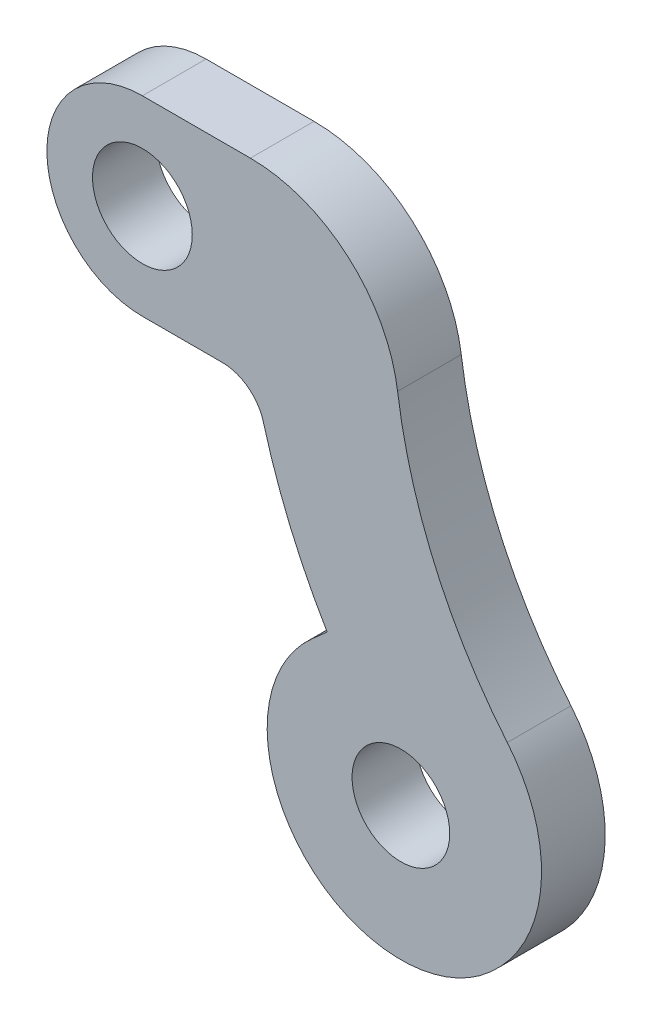
ISO-10303-21;
HEADER;
FILE_DESCRIPTION(('STEP AP214'),'2;1');
FILE_NAME('part.step','',(''),(''),'','','');
FILE_SCHEMA(('AUTOMOTIVE_DESIGN { 1 0 10303 214 1 1 1 1 }'));
ENDSEC;
DATA;
#1=APPLICATION_CONTEXT('core data for automotive mechanical design processes');
#2=APPLICATION_PROTOCOL_DEFINITION('international standard','automotive_design',2000,#1);
#3=PRODUCT_CONTEXT('',#1,'mechanical');
#4=PRODUCT('Part','Part','',(#3));
#5=PRODUCT_RELATED_PRODUCT_CATEGORY('part','',(#4));
#6=PRODUCT_DEFINITION_FORMATION('','',#4);
#7=PRODUCT_DEFINITION_CONTEXT('part definition',#1,'design');
#8=PRODUCT_DEFINITION('design','',#6,#7);
#9=PRODUCT_DEFINITION_SHAPE('','',#8);
#10=(LENGTH_UNIT() NAMED_UNIT(*) SI_UNIT(.MILLI.,.METRE.));
#11=(NAMED_UNIT(*) PLANE_ANGLE_UNIT() SI_UNIT($,.RADIAN.));
#12=(NAMED_UNIT(*) SI_UNIT($,.STERADIAN.) SOLID_ANGLE_UNIT());
#13=UNCERTAINTY_MEASURE_WITH_UNIT(LENGTH_MEASURE(1.E-05),#10,'distance_accuracy_value','');
#14=(GEOMETRIC_REPRESENTATION_CONTEXT(3) GLOBAL_UNCERTAINTY_ASSIGNED_CONTEXT((#13)) GLOBAL_UNIT_ASSIGNED_CONTEXT((#10,
#11,#12)) REPRESENTATION_CONTEXT('',''));
#15=CARTESIAN_POINT('',(0.,0.,0.));
#16=DIRECTION('',(0.,0.,1.));
#17=DIRECTION('',(1.,0.,0.));
#18=AXIS2_PLACEMENT_3D('',#15,#16,#17);
#19=CARTESIAN_POINT('',(-19.9422261752407,44.7189600164803,-127.243878979662));
#20=DIRECTION('',(0.,0.,-1.));
#21=DIRECTION('',(-1.,0.,0.));
#22=AXIS2_PLACEMENT_3D('',#19,#20,#21);
#23=CYLINDRICAL_SURFACE('',#22,2.);
#24=CARTESIAN_POINT('',(-19.9422261752407,44.7189600164803,-130.243878979662));
#25=DIRECTION('',(0.,0.,1.));
#26=DIRECTION('',(1.,0.,0.));
#27=AXIS2_PLACEMENT_3D('',#24,#25,#26);
#28=CIRCLE('',#27,2.);
#29=CARTESIAN_POINT('',(-19.9422261752407,46.7189600164803,-130.243878979662));
#30=VERTEX_POINT('',#29);
#31=CARTESIAN_POINT('',(-18.0136160189661,45.2485477541048,-130.243878979662));
#32=VERTEX_POINT('',#31);
#33=EDGE_CURVE('E162',#30,#32,#28,.F.);
#34=ORIENTED_EDGE('',*,*,#33,.T.);
#35=DIRECTION('',(0.,0.,-1.));
#36=VECTOR('',#35,1.);
#37=CARTESIAN_POINT('',(-18.0136160189661,45.2485477541048,-127.243878979662));
#38=LINE('',#37,#36);
#39=CARTESIAN_POINT('',(-18.0136160189661,45.2485477541048,-127.243878979662));
#40=VERTEX_POINT('',#39);
#41=EDGE_CURVE('E11',#40,#32,#38,.T.);
#42=ORIENTED_EDGE('',*,*,#41,.F.);
#43=CARTESIAN_POINT('',(-19.9422261752407,44.7189600164803,-127.243878979662));
#44=DIRECTION('',(0.,0.,1.));
#45=DIRECTION('',(1.,0.,0.));
#46=AXIS2_PLACEMENT_3D('',#43,#44,#45);
#47=CIRCLE('',#46,2.);
#48=CARTESIAN_POINT('',(-19.9422261752407,46.7189600164803,-127.243878979662));
#49=VERTEX_POINT('',#48);
#50=EDGE_CURVE('E192',#49,#40,#47,.F.);
#51=ORIENTED_EDGE('',*,*,#50,.F.);
#52=DIRECTION('',(0.,0.,-1.));
#53=VECTOR('',#52,1.);
#54=CARTESIAN_POINT('',(-19.9422261752407,46.7189600164803,-127.243878979662));
#55=LINE('',#54,#53);
#56=EDGE_CURVE('E161',#49,#30,#55,.T.);
#57=ORIENTED_EDGE('',*,*,#56,.T.);
#58=EDGE_LOOP('',(#34,#42,#51,#57));
#59=FACE_BOUND('',#58,.T.);
#60=ADVANCED_FACE('F39',(#59),#23,.F.);
#61=CARTESIAN_POINT('',(9.61372850102481,52.8348932025687,-127.243878979662));
#62=DIRECTION('',(0.,0.,-1.));
#63=DIRECTION('',(-1.,0.,0.));
#64=AXIS2_PLACEMENT_3D('',#61,#62,#63);
#65=CYLINDRICAL_SURFACE('',#64,28.6500052117645);
#66=CARTESIAN_POINT('',(9.61372850102481,52.8348932025687,-130.243878979662));
#67=DIRECTION('',(0.,0.,1.));
#68=DIRECTION('',(1.,0.,0.));
#69=AXIS2_PLACEMENT_3D('',#66,#67,#68);
#70=CIRCLE('',#69,28.6500052117645);
#71=CARTESIAN_POINT('',(-15.0100594881716,38.189351894841,-130.243878979662));
#72=VERTEX_POINT('',#71);
#73=EDGE_CURVE('E165',#32,#72,#70,.T.);
#74=ORIENTED_EDGE('',*,*,#73,.T.);
#75=DIRECTION('',(0.,0.,-1.));
#76=VECTOR('',#75,1.);
#77=CARTESIAN_POINT('',(-15.0100594881716,38.189351894841,-127.243878979662));
#78=LINE('',#77,#76);
#79=CARTESIAN_POINT('',(-15.0100594881716,38.189351894841,-127.243878979662));
#80=VERTEX_POINT('',#79);
#81=EDGE_CURVE('E47',#80,#72,#78,.T.);
#82=ORIENTED_EDGE('',*,*,#81,.F.);
#83=CARTESIAN_POINT('',(9.61372850102481,52.8348932025687,-127.243878979662));
#84=DIRECTION('',(0.,0.,1.));
#85=DIRECTION('',(1.,0.,0.));
#86=AXIS2_PLACEMENT_3D('',#83,#84,#85);
#87=CIRCLE('',#86,28.6500052117645);
#88=EDGE_CURVE('E106',#40,#80,#87,.T.);
#89=ORIENTED_EDGE('',*,*,#88,.F.);
#90=ORIENTED_EDGE('',*,*,#41,.T.);
#91=EDGE_LOOP('',(#74,#82,#89,#90));
#92=FACE_BOUND('',#91,.T.);
#93=ADVANCED_FACE('F256',(#92),#65,.T.);
#94=CARTESIAN_POINT('',(-25.5317117816848,28.8911475424345,-127.243878979662));
#95=DIRECTION('',(0.662197796471688,-0.749329085481166,0.));
#96=DIRECTION('',(0.749329085481166,0.662197796471688,0.));
#97=AXIS2_PLACEMENT_3D('',#94,#95,#96);
#98=PLANE('',#97);
#99=DIRECTION('',(-0.749329085481166,-0.662197796471688,0.));
#100=VECTOR('',#99,1.);
#101=CARTESIAN_POINT('',(-25.5317117816848,28.8911475424345,-130.243878979662));
#102=LINE('',#101,#100);
#103=CARTESIAN_POINT('',(-15.7081176167469,37.5724633161,-130.243878979662));
#104=VERTEX_POINT('',#103);
#105=EDGE_CURVE('E167',#72,#104,#102,.T.);
#106=ORIENTED_EDGE('',*,*,#105,.T.);
#107=DIRECTION('',(0.,0.,-1.));
#108=VECTOR('',#107,1.);
#109=CARTESIAN_POINT('',(-15.7081176167469,37.5724633161,-127.243878979662));
#110=LINE('',#109,#108);
#111=CARTESIAN_POINT('',(-15.7081176167469,37.5724633161,-127.243878979662));
#112=VERTEX_POINT('',#111);
#113=EDGE_CURVE('E205',#112,#104,#110,.T.);
#114=ORIENTED_EDGE('',*,*,#113,.F.);
#115=DIRECTION('',(-0.749329085481166,-0.662197796471688,0.));
#116=VECTOR('',#115,1.);
#117=CARTESIAN_POINT('',(-25.5317117816848,28.8911475424345,-127.243878979662));
#118=LINE('',#117,#116);
#119=EDGE_CURVE('E213',#80,#112,#118,.T.);
#120=ORIENTED_EDGE('',*,*,#119,.F.);
#121=ORIENTED_EDGE('',*,*,#81,.T.);
#122=EDGE_LOOP('',(#106,#114,#120,#121));
#123=FACE_BOUND('',#122,.T.);
#124=ADVANCED_FACE('F211',(#123),#98,.F.);
#125=CARTESIAN_POINT('',(-11.5362714989752,32.8516900775687,-127.243878979662));
#126=DIRECTION('',(0.,0.,-1.));
#127=DIRECTION('',(-1.,0.,0.));
#128=AXIS2_PLACEMENT_3D('',#125,#126,#127);
#129=CYLINDRICAL_SURFACE('',#128,6.30000000000002);
#130=CARTESIAN_POINT('',(-11.5362714989752,32.8516900775687,-130.243878979662));
#131=DIRECTION('',(0.,0.,1.));
#132=DIRECTION('',(1.,0.,0.));
#133=AXIS2_PLACEMENT_3D('',#130,#131,#132);
#134=CIRCLE('',#133,6.30000000000002);
#135=CARTESIAN_POINT('',(-7.36442538120341,28.1309168390375,-130.243878979662));
#136=VERTEX_POINT('',#135);
#137=EDGE_CURVE('E169',#104,#136,#134,.T.);
#138=ORIENTED_EDGE('',*,*,#137,.T.);
#139=DIRECTION('',(0.,0.,-1.));
#140=VECTOR('',#139,1.);
#141=CARTESIAN_POINT('',(-7.36442538120341,28.1309168390375,-127.243878979662));
#142=LINE('',#141,#140);
#143=CARTESIAN_POINT('',(-7.36442538120341,28.1309168390375,-127.243878979662));
#144=VERTEX_POINT('',#143);
#145=EDGE_CURVE('E202',#144,#136,#142,.T.);
#146=ORIENTED_EDGE('',*,*,#145,.F.);
#147=CARTESIAN_POINT('',(-11.5362714989752,32.8516900775687,-127.243878979662));
#148=DIRECTION('',(0.,0.,1.));
#149=DIRECTION('',(1.,0.,0.));
#150=AXIS2_PLACEMENT_3D('',#147,#148,#149);
#151=CIRCLE('',#150,6.30000000000002);
#152=EDGE_CURVE('E232',#112,#144,#151,.T.);
#153=ORIENTED_EDGE('',*,*,#152,.F.);
#154=ORIENTED_EDGE('',*,*,#113,.T.);
#155=EDGE_LOOP('',(#138,#146,#153,#154));
#156=FACE_BOUND('',#155,.T.);
#157=ADVANCED_FACE('F222',(#156),#129,.T.);
#158=CARTESIAN_POINT('',(-17.1880195461419,19.4496010653708,-127.243878979662));
#159=DIRECTION('',(-0.662197796471717,0.749329085481141,0.));
#160=DIRECTION('',(-0.749329085481141,-0.662197796471717,0.));
#161=AXIS2_PLACEMENT_3D('',#158,#159,#160);
#162=PLANE('',#161);
#163=DIRECTION('',(0.749329085481141,0.662197796471717,0.));
#164=VECTOR('',#163,1.);
#165=CARTESIAN_POINT('',(-17.1880195461419,19.4496010653708,-130.243878979662));
#166=LINE('',#165,#164);
#167=CARTESIAN_POINT('',(-7.27434556011419,28.2105222623257,-130.243878979662));
#168=VERTEX_POINT('',#167);
#169=EDGE_CURVE('E171',#136,#168,#166,.T.);
#170=ORIENTED_EDGE('',*,*,#169,.T.);
#171=DIRECTION('',(0.,0.,-1.));
#172=VECTOR('',#171,1.);
#173=CARTESIAN_POINT('',(-7.27434556011419,28.2105222623257,-127.243878979662));
#174=LINE('',#173,#172);
#175=CARTESIAN_POINT('',(-7.27434556011419,28.2105222623257,-127.243878979662));
#176=VERTEX_POINT('',#175);
#177=EDGE_CURVE('E200',#176,#168,#174,.T.);
#178=ORIENTED_EDGE('',*,*,#177,.F.);
#179=DIRECTION('',(0.749329085481141,0.662197796471717,0.));
#180=VECTOR('',#179,1.);
#181=CARTESIAN_POINT('',(-17.1880195461419,19.4496010653708,-127.243878979662));
#182=LINE('',#181,#180);
#183=EDGE_CURVE('E228',#144,#176,#182,.T.);
#184=ORIENTED_EDGE('',*,*,#183,.F.);
#185=ORIENTED_EDGE('',*,*,#145,.T.);
#186=EDGE_LOOP('',(#170,#178,#184,#185));
#187=FACE_BOUND('',#186,.T.);
#188=ADVANCED_FACE('F226',(#187),#162,.F.);
#189=CARTESIAN_POINT('',(-11.9097301354153,33.4558258606926,-127.243878979662));
#190=DIRECTION('',(0.,0.,-1.));
#191=DIRECTION('',(-1.,0.,0.));
#192=AXIS2_PLACEMENT_3D('',#189,#190,#191);
#193=CYLINDRICAL_SURFACE('',#192,7.);
#194=CARTESIAN_POINT('',(-11.9097301354153,33.4558258606926,-130.243878979662));
#195=DIRECTION('',(0.,0.,1.));
#196=DIRECTION('',(1.,0.,0.));
#197=AXIS2_PLACEMENT_3D('',#194,#195,#196);
#198=CIRCLE('',#197,7.);
#199=CARTESIAN_POINT('',(-6.52289642895534,37.925951431518,-130.243878979662));
#200=VERTEX_POINT('',#199);
#201=EDGE_CURVE('E174',#200,#168,#198,.F.);
#202=ORIENTED_EDGE('',*,*,#201,.F.);
#203=DIRECTION('',(0.,0.,-1.));
#204=VECTOR('',#203,1.);
#205=CARTESIAN_POINT('',(-6.52289642895534,37.925951431518,-127.243878979662));
#206=LINE('',#205,#204);
#207=CARTESIAN_POINT('',(-6.52289642895534,37.925951431518,-127.243878979662));
#208=VERTEX_POINT('',#207);
#209=EDGE_CURVE('E198',#208,#200,#206,.T.);
#210=ORIENTED_EDGE('',*,*,#209,.F.);
#211=CARTESIAN_POINT('',(-11.9097301354153,33.4558258606926,-127.243878979662));
#212=DIRECTION('',(0.,0.,1.));
#213=DIRECTION('',(1.,0.,0.));
#214=AXIS2_PLACEMENT_3D('',#211,#212,#213);
#215=CIRCLE('',#214,7.);
#216=EDGE_CURVE('E231',#208,#176,#215,.F.);
#217=ORIENTED_EDGE('',*,*,#216,.T.);
#218=ORIENTED_EDGE('',*,*,#177,.T.);
#219=EDGE_LOOP('',(#202,#210,#217,#218));
#220=FACE_BOUND('',#219,.T.);
#221=ADVANCED_FACE('F243',(#220),#193,.T.);
#222=CARTESIAN_POINT('',(11.4637285010269,52.8516900775688,-127.243878979662));
#223=DIRECTION('',(0.,0.,-1.));
#224=DIRECTION('',(-1.,0.,0.));
#225=AXIS2_PLACEMENT_3D('',#222,#223,#224);
#226=CYLINDRICAL_SURFACE('',#225,23.3729833462071);
#227=CARTESIAN_POINT('',(11.4637285010269,52.8516900775688,-130.243878979662));
#228=DIRECTION('',(0.,0.,1.));
#229=DIRECTION('',(1.,0.,0.));
#230=AXIS2_PLACEMENT_3D('',#227,#228,#229);
#231=CIRCLE('',#230,23.3729833462071);
#232=CARTESIAN_POINT('',(-11.6918808655017,49.6714219494379,-130.243878979662));
#233=VERTEX_POINT('',#232);
#234=EDGE_CURVE('E177',#233,#200,#231,.T.);
#235=ORIENTED_EDGE('',*,*,#234,.F.);
#236=DIRECTION('',(0.,0.,-1.));
#237=VECTOR('',#236,1.);
#238=CARTESIAN_POINT('',(-11.6918808655017,49.6714219494379,-127.243878979662));
#239=LINE('',#238,#237);
#240=CARTESIAN_POINT('',(-11.6918808655017,49.6714219494379,-127.243878979662));
#241=VERTEX_POINT('',#240);
#242=EDGE_CURVE('E196',#241,#233,#239,.T.);
#243=ORIENTED_EDGE('',*,*,#242,.F.);
#244=CARTESIAN_POINT('',(11.4637285010269,52.8516900775688,-127.243878979662));
#245=DIRECTION('',(0.,0.,1.));
#246=DIRECTION('',(1.,0.,0.));
#247=AXIS2_PLACEMENT_3D('',#244,#245,#246);
#248=CIRCLE('',#247,23.3729833462071);
#249=EDGE_CURVE('E150',#241,#208,#248,.T.);
#250=ORIENTED_EDGE('',*,*,#249,.T.);
#251=ORIENTED_EDGE('',*,*,#209,.T.);
#252=EDGE_LOOP('',(#235,#243,#250,#251));
#253=FACE_BOUND('',#252,.T.);
#254=ADVANCED_FACE('F240',(#253),#226,.F.);
#255=CARTESIAN_POINT('',(-18.6267792977981,48.7189600164802,-127.243878979662));
#256=DIRECTION('',(0.,0.,-1.));
#257=DIRECTION('',(-1.,0.,0.));
#258=AXIS2_PLACEMENT_3D('',#255,#256,#257);
#259=CYLINDRICAL_SURFACE('',#258,7.);
#260=CARTESIAN_POINT('',(-18.6267792977981,48.7189600164802,-130.243878979662));
#261=DIRECTION('',(0.,0.,1.));
#262=DIRECTION('',(1.,0.,0.));
#263=AXIS2_PLACEMENT_3D('',#260,#261,#262);
#264=CIRCLE('',#263,7.);
#265=CARTESIAN_POINT('',(-18.6267792977981,55.7189600164802,-130.243878979662));
#266=VERTEX_POINT('',#265);
#267=EDGE_CURVE('E180',#233,#266,#264,.T.);
#268=ORIENTED_EDGE('',*,*,#267,.T.);
#269=DIRECTION('',(0.,0.,-1.));
#270=VECTOR('',#269,1.);
#271=CARTESIAN_POINT('',(-18.6267792977981,55.7189600164802,-127.243878979662));
#272=LINE('',#271,#270);
#273=CARTESIAN_POINT('',(-18.6267792977981,55.7189600164802,-127.243878979662));
#274=VERTEX_POINT('',#273);
#275=EDGE_CURVE('E137',#274,#266,#272,.T.);
#276=ORIENTED_EDGE('',*,*,#275,.F.);
#277=CARTESIAN_POINT('',(-18.6267792977981,48.7189600164802,-127.243878979662));
#278=DIRECTION('',(0.,0.,1.));
#279=DIRECTION('',(1.,0.,0.));
#280=AXIS2_PLACEMENT_3D('',#277,#278,#279);
#281=CIRCLE('',#280,7.);
#282=EDGE_CURVE('E147',#241,#274,#281,.T.);
#283=ORIENTED_EDGE('',*,*,#282,.F.);
#284=ORIENTED_EDGE('',*,*,#242,.T.);
#285=EDGE_LOOP('',(#268,#276,#283,#284));
#286=FACE_BOUND('',#285,.T.);
#287=ADVANCED_FACE('F246',(#286),#259,.T.);
#288=CARTESIAN_POINT('',(0.,55.7189600164802,-127.243878979662));
#289=DIRECTION('',(0.,1.,0.));
#290=DIRECTION('',(0.,0.,1.));
#291=AXIS2_PLACEMENT_3D('',#288,#289,#290);
#292=PLANE('',#291);
#293=DIRECTION('',(1.,0.,0.));
#294=VECTOR('',#293,1.);
#295=CARTESIAN_POINT('',(0.,55.7189600164802,-130.243878979662));
#296=LINE('',#295,#294);
#297=CARTESIAN_POINT('',(-23.7160538447542,55.7189600164802,-130.243878979662));
#298=VERTEX_POINT('',#297);
#299=EDGE_CURVE('E136',#298,#266,#296,.T.);
#300=ORIENTED_EDGE('',*,*,#299,.F.);
#301=DIRECTION('',(0.,0.,-1.));
#302=VECTOR('',#301,1.);
#303=CARTESIAN_POINT('',(-23.7160538447542,55.7189600164802,-127.243878979662));
#304=LINE('',#303,#302);
#305=CARTESIAN_POINT('',(-23.7160538447542,55.7189600164802,-127.243878979662));
#306=VERTEX_POINT('',#305);
#307=EDGE_CURVE('E130',#306,#298,#304,.T.);
#308=ORIENTED_EDGE('',*,*,#307,.F.);
#309=DIRECTION('',(1.,0.,0.));
#310=VECTOR('',#309,1.);
#311=CARTESIAN_POINT('',(0.,55.7189600164802,-127.243878979662));
#312=LINE('',#311,#310);
#313=EDGE_CURVE('E134',#306,#274,#312,.T.);
#314=ORIENTED_EDGE('',*,*,#313,.T.);
#315=ORIENTED_EDGE('',*,*,#275,.T.);
#316=EDGE_LOOP('',(#300,#308,#314,#315));
#317=FACE_BOUND('',#316,.T.);
#318=ADVANCED_FACE('F132',(#317),#292,.T.);
#319=CARTESIAN_POINT('',(-23.7160538447542,51.2189600164802,-127.243878979662));
#320=DIRECTION('',(0.,0.,-1.));
#321=DIRECTION('',(-1.,0.,0.));
#322=AXIS2_PLACEMENT_3D('',#319,#320,#321);
#323=CYLINDRICAL_SURFACE('',#322,4.5);
#324=CARTESIAN_POINT('',(-23.7160538447542,51.2189600164802,-130.243878979662));
#325=DIRECTION('',(0.,0.,1.));
#326=DIRECTION('',(1.,0.,0.));
#327=AXIS2_PLACEMENT_3D('',#324,#325,#326);
#328=CIRCLE('',#327,4.5);
#329=CARTESIAN_POINT('',(-23.7160538447542,46.7189600164802,-130.243878979662));
#330=VERTEX_POINT('',#329);
#331=EDGE_CURVE('E92',#298,#330,#328,.T.);
#332=ORIENTED_EDGE('',*,*,#331,.T.);
#333=DIRECTION('',(0.,0.,-1.));
#334=VECTOR('',#333,1.);
#335=CARTESIAN_POINT('',(-23.7160538447542,46.7189600164802,-127.243878979662));
#336=LINE('',#335,#334);
#337=CARTESIAN_POINT('',(-23.7160538447542,46.7189600164802,-127.243878979662));
#338=VERTEX_POINT('',#337);
#339=EDGE_CURVE('E138',#338,#330,#336,.T.);
#340=ORIENTED_EDGE('',*,*,#339,.F.);
#341=CARTESIAN_POINT('',(-23.7160538447542,51.2189600164802,-127.243878979662));
#342=DIRECTION('',(0.,0.,1.));
#343=DIRECTION('',(1.,0.,0.));
#344=AXIS2_PLACEMENT_3D('',#341,#342,#343);
#345=CIRCLE('',#344,4.5);
#346=EDGE_CURVE('E140',#306,#338,#345,.T.);
#347=ORIENTED_EDGE('',*,*,#346,.F.);
#348=ORIENTED_EDGE('',*,*,#307,.T.);
#349=EDGE_LOOP('',(#332,#340,#347,#348));
#350=FACE_BOUND('',#349,.T.);
#351=ADVANCED_FACE('F141',(#350),#323,.T.);
#352=CARTESIAN_POINT('',(-23.7160538447542,51.2189600164802,-127.243878979662));
#353=DIRECTION('',(0.,0.,-1.));
#354=DIRECTION('',(-1.,0.,0.));
#355=AXIS2_PLACEMENT_3D('',#352,#353,#354);
#356=CYLINDRICAL_SURFACE('',#355,2.35);
#357=CARTESIAN_POINT('',(-23.7160538447542,51.2189600164802,-127.243878979662));
#358=DIRECTION('',(0.,0.,1.));
#359=DIRECTION('',(1.,0.,0.));
#360=AXIS2_PLACEMENT_3D('',#357,#358,#359);
#361=CIRCLE('',#360,2.35);
#362=CARTESIAN_POINT('',(-21.3660538447542,51.2189600164802,-127.243878979662));
#363=VERTEX_POINT('',#362);
#364=EDGE_CURVE('E155',#363,#363,#361,.T.);
#365=ORIENTED_EDGE('',*,*,#364,.T.);
#366=EDGE_LOOP('',(#365));
#367=FACE_BOUND('',#366,.T.);
#368=CARTESIAN_POINT('',(-23.7160538447542,51.2189600164802,-130.243878979662));
#369=DIRECTION('',(0.,0.,1.));
#370=DIRECTION('',(1.,0.,0.));
#371=AXIS2_PLACEMENT_3D('',#368,#369,#370);
#372=CIRCLE('',#371,2.35);
#373=CARTESIAN_POINT('',(-21.3660538447542,51.2189600164802,-130.243878979662));
#374=VERTEX_POINT('',#373);
#375=EDGE_CURVE('E186',#374,#374,#372,.T.);
#376=ORIENTED_EDGE('',*,*,#375,.F.);
#377=EDGE_LOOP('',(#376));
#378=FACE_BOUND('',#377,.T.);
#379=ADVANCED_FACE('F266',(#367,#378),#356,.F.);
#380=CARTESIAN_POINT('',(0.,46.7189600164803,-127.243878979662));
#381=DIRECTION('',(0.,1.,0.));
#382=DIRECTION('',(-1.,0.,0.));
#383=AXIS2_PLACEMENT_3D('',#380,#381,#382);
#384=PLANE('',#383);
#385=DIRECTION('',(1.,0.,0.));
#386=VECTOR('',#385,1.);
#387=CARTESIAN_POINT('',(0.,46.7189600164803,-130.243878979662));
#388=LINE('',#387,#386);
#389=EDGE_CURVE('E98',#330,#30,#388,.T.);
#390=ORIENTED_EDGE('',*,*,#389,.T.);
#391=ORIENTED_EDGE('',*,*,#56,.F.);
#392=DIRECTION('',(1.,0.,0.));
#393=VECTOR('',#392,1.);
#394=CARTESIAN_POINT('',(0.,46.7189600164803,-127.243878979662));
#395=LINE('',#394,#393);
#396=EDGE_CURVE('E55',#338,#49,#395,.T.);
#397=ORIENTED_EDGE('',*,*,#396,.F.);
#398=ORIENTED_EDGE('',*,*,#339,.T.);
#399=EDGE_LOOP('',(#390,#391,#397,#398));
#400=FACE_BOUND('',#399,.T.);
#401=ADVANCED_FACE('F263',(#400),#384,.F.);
#402=CARTESIAN_POINT('',(-11.5362714989739,32.8516900775688,-127.243878979662));
#403=DIRECTION('',(0.,0.,-1.));
#404=DIRECTION('',(-1.,0.,0.));
#405=AXIS2_PLACEMENT_3D('',#402,#403,#404);
#406=CYLINDRICAL_SURFACE('',#405,2.3);
#407=CARTESIAN_POINT('',(-11.5362714989739,32.8516900775688,-127.243878979662));
#408=DIRECTION('',(0.,0.,1.));
#409=DIRECTION('',(1.,0.,0.));
#410=AXIS2_PLACEMENT_3D('',#407,#408,#409);
#411=CIRCLE('',#410,2.3);
#412=CARTESIAN_POINT('',(-9.23627149897394,32.8516900775688,-127.243878979662));
#413=VERTEX_POINT('',#412);
#414=EDGE_CURVE('E158',#413,#413,#411,.T.);
#415=ORIENTED_EDGE('',*,*,#414,.T.);
#416=EDGE_LOOP('',(#415));
#417=FACE_BOUND('',#416,.T.);
#418=CARTESIAN_POINT('',(-11.5362714989739,32.8516900775688,-130.243878979662));
#419=DIRECTION('',(0.,0.,1.));
#420=DIRECTION('',(1.,0.,0.));
#421=AXIS2_PLACEMENT_3D('',#418,#419,#420);
#422=CIRCLE('',#421,2.3);
#423=CARTESIAN_POINT('',(-9.23627149897394,32.8516900775688,-130.243878979662));
#424=VERTEX_POINT('',#423);
#425=EDGE_CURVE('E189',#424,#424,#422,.T.);
#426=ORIENTED_EDGE('',*,*,#425,.F.);
#427=EDGE_LOOP('',(#426));
#428=FACE_BOUND('',#427,.T.);
#429=ADVANCED_FACE('F265',(#417,#428),#406,.F.);
#430=CARTESIAN_POINT('',(0.,0.,-127.243878979662));
#431=DIRECTION('',(0.,0.,1.));
#432=DIRECTION('',(1.,0.,0.));
#433=AXIS2_PLACEMENT_3D('',#430,#431,#432);
#434=PLANE('',#433);
#435=ORIENTED_EDGE('',*,*,#50,.T.);
#436=ORIENTED_EDGE('',*,*,#88,.T.);
#437=ORIENTED_EDGE('',*,*,#119,.T.);
#438=ORIENTED_EDGE('',*,*,#152,.T.);
#439=ORIENTED_EDGE('',*,*,#183,.T.);
#440=ORIENTED_EDGE('',*,*,#216,.F.);
#441=ORIENTED_EDGE('',*,*,#249,.F.);
#442=ORIENTED_EDGE('',*,*,#282,.T.);
#443=ORIENTED_EDGE('',*,*,#313,.F.);
#444=ORIENTED_EDGE('',*,*,#346,.T.);
#445=ORIENTED_EDGE('',*,*,#396,.T.);
#446=EDGE_LOOP('',(#435,#436,#437,#438,#439,#440,#441,#442,#443,#444,#445));
#447=FACE_BOUND('',#446,.T.);
#448=ORIENTED_EDGE('',*,*,#364,.F.);
#449=EDGE_LOOP('',(#448));
#450=FACE_BOUND('',#449,.T.);
#451=ORIENTED_EDGE('',*,*,#414,.F.);
#452=EDGE_LOOP('',(#451));
#453=FACE_BOUND('',#452,.T.);
#454=ADVANCED_FACE('F143',(#447,#450,#453),#434,.T.);
#455=CARTESIAN_POINT('',(0.,0.,-130.243878979662));
#456=DIRECTION('',(0.,0.,1.));
#457=DIRECTION('',(1.,0.,0.));
#458=AXIS2_PLACEMENT_3D('',#455,#456,#457);
#459=PLANE('',#458);
#460=ORIENTED_EDGE('',*,*,#33,.F.);
#461=ORIENTED_EDGE('',*,*,#389,.F.);
#462=ORIENTED_EDGE('',*,*,#331,.F.);
#463=ORIENTED_EDGE('',*,*,#299,.T.);
#464=ORIENTED_EDGE('',*,*,#267,.F.);
#465=ORIENTED_EDGE('',*,*,#234,.T.);
#466=ORIENTED_EDGE('',*,*,#201,.T.);
#467=ORIENTED_EDGE('',*,*,#169,.F.);
#468=ORIENTED_EDGE('',*,*,#137,.F.);
#469=ORIENTED_EDGE('',*,*,#105,.F.);
#470=ORIENTED_EDGE('',*,*,#73,.F.);
#471=EDGE_LOOP('',(#460,#461,#462,#463,#464,#465,#466,#467,#468,#469,#470));
#472=FACE_BOUND('',#471,.T.);
#473=ORIENTED_EDGE('',*,*,#375,.T.);
#474=EDGE_LOOP('',(#473));
#475=FACE_BOUND('',#474,.T.);
#476=ORIENTED_EDGE('',*,*,#425,.T.);
#477=EDGE_LOOP('',(#476));
#478=FACE_BOUND('',#477,.T.);
#479=ADVANCED_FACE('F217',(#472,#475,#478),#459,.F.);
#480=CLOSED_SHELL('',(#60,#93,#124,#157,#188,#221,#254,#287,#318,#351,#379,#401,#429,#454,#479));
#481=MANIFOLD_SOLID_BREP('B2',#480);
#482=ADVANCED_BREP_SHAPE_REPRESENTATION('',(#18,#481),#14);
#483=SHAPE_DEFINITION_REPRESENTATION(#9,#482);
ENDSEC;
END-ISO-10303-21;
